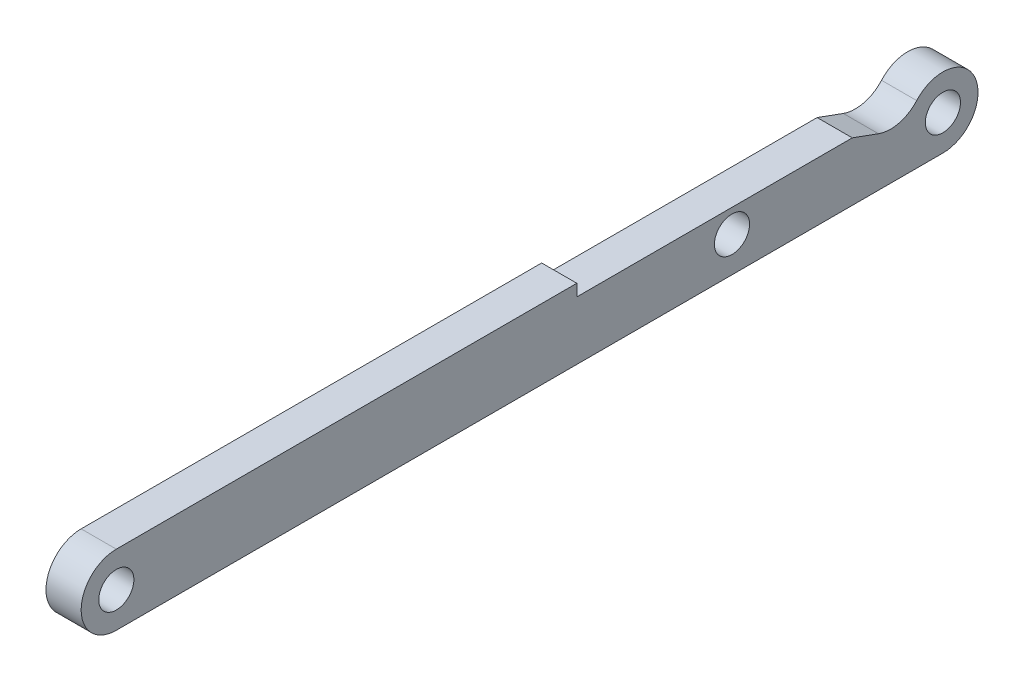
ISO-10303-21;
HEADER;
FILE_DESCRIPTION(('STEP AP214'),'2;1');
FILE_NAME('part.step','',(''),(''),'','','');
FILE_SCHEMA(('AUTOMOTIVE_DESIGN { 1 0 10303 214 1 1 1 1 }'));
ENDSEC;
DATA;
#1=APPLICATION_CONTEXT('core data for automotive mechanical design processes');
#2=APPLICATION_PROTOCOL_DEFINITION('international standard','automotive_design',2000,#1);
#3=PRODUCT_CONTEXT('',#1,'mechanical');
#4=PRODUCT('Part','Part','',(#3));
#5=PRODUCT_RELATED_PRODUCT_CATEGORY('part','',(#4));
#6=PRODUCT_DEFINITION_FORMATION('','',#4);
#7=PRODUCT_DEFINITION_CONTEXT('part definition',#1,'design');
#8=PRODUCT_DEFINITION('design','',#6,#7);
#9=PRODUCT_DEFINITION_SHAPE('','',#8);
#10=(LENGTH_UNIT() NAMED_UNIT(*) SI_UNIT(.MILLI.,.METRE.));
#11=(NAMED_UNIT(*) PLANE_ANGLE_UNIT() SI_UNIT($,.RADIAN.));
#12=(NAMED_UNIT(*) SI_UNIT($,.STERADIAN.) SOLID_ANGLE_UNIT());
#13=UNCERTAINTY_MEASURE_WITH_UNIT(LENGTH_MEASURE(1.E-05),#10,'distance_accuracy_value','');
#14=(GEOMETRIC_REPRESENTATION_CONTEXT(3) GLOBAL_UNCERTAINTY_ASSIGNED_CONTEXT((#13)) GLOBAL_UNIT_ASSIGNED_CONTEXT((#10,
#11,#12)) REPRESENTATION_CONTEXT('',''));
#15=CARTESIAN_POINT('',(0.,0.,0.));
#16=DIRECTION('',(0.,0.,1.));
#17=DIRECTION('',(1.,0.,0.));
#18=AXIS2_PLACEMENT_3D('',#15,#16,#17);
#19=CARTESIAN_POINT('',(-1.,-0.162479586942259,0.153639897585327));
#20=DIRECTION('',(1.,0.,0.));
#21=DIRECTION('',(0.,0.,-1.));
#22=AXIS2_PLACEMENT_3D('',#19,#20,#21);
#23=CYLINDRICAL_SURFACE('',#22,2.);
#24=DIRECTION('',(1.,0.,0.));
#25=VECTOR('',#24,1.);
#26=CARTESIAN_POINT('',(-1.,-2.04186482851408,0.837680184236665));
#27=LINE('',#26,#25);
#28=CARTESIAN_POINT('',(-1.,-2.04186482851408,0.837680184236665));
#29=VERTEX_POINT('',#28);
#30=CARTESIAN_POINT('',(1.,-2.04186482851408,0.837680184236665));
#31=VERTEX_POINT('',#30);
#32=EDGE_CURVE('E123',#29,#31,#27,.T.);
#33=ORIENTED_EDGE('',*,*,#32,.T.);
#34=CARTESIAN_POINT('',(1.,-0.162479586942259,0.153639897585327));
#35=DIRECTION('',(1.,0.,0.));
#36=DIRECTION('',(0.,0.,-1.));
#37=AXIS2_PLACEMENT_3D('',#34,#35,#36);
#38=CIRCLE('',#37,2.);
#39=CARTESIAN_POINT('',(1.,-1.49545335584422,-1.33739361358043));
#40=VERTEX_POINT('',#39);
#41=EDGE_CURVE('E158',#31,#40,#38,.T.);
#42=ORIENTED_EDGE('',*,*,#41,.T.);
#43=DIRECTION('',(1.,0.,0.));
#44=VECTOR('',#43,1.);
#45=CARTESIAN_POINT('',(-1.,-1.49545335584422,-1.33739361358043));
#46=LINE('',#45,#44);
#47=CARTESIAN_POINT('',(-1.,-1.49545335584422,-1.33739361358043));
#48=VERTEX_POINT('',#47);
#49=EDGE_CURVE('E145',#48,#40,#46,.T.);
#50=ORIENTED_EDGE('',*,*,#49,.F.);
#51=CARTESIAN_POINT('',(-1.,-0.162479586942259,0.153639897585327));
#52=DIRECTION('',(1.,0.,0.));
#53=DIRECTION('',(0.,0.,-1.));
#54=AXIS2_PLACEMENT_3D('',#51,#52,#53);
#55=CIRCLE('',#54,2.);
#56=EDGE_CURVE('E62',#29,#48,#55,.T.);
#57=ORIENTED_EDGE('',*,*,#56,.F.);
#58=EDGE_LOOP('',(#33,#42,#50,#57));
#59=FACE_BOUND('',#58,.T.);
#60=ADVANCED_FACE('F40',(#59),#23,.F.);
#61=CARTESIAN_POINT('',(-1.,-2.82842712474618,-2.8284271247462));
#62=DIRECTION('',(1.,0.,0.));
#63=DIRECTION('',(0.,0.,-1.));
#64=AXIS2_PLACEMENT_3D('',#61,#62,#63);
#65=CYLINDRICAL_SURFACE('',#64,2.);
#66=ORIENTED_EDGE('',*,*,#49,.T.);
#67=CARTESIAN_POINT('',(1.,-2.82842712474618,-2.8284271247462));
#68=DIRECTION('',(1.,0.,0.));
#69=DIRECTION('',(0.,0.,-1.));
#70=AXIS2_PLACEMENT_3D('',#67,#68,#69);
#71=CIRCLE('',#70,2.);
#72=CARTESIAN_POINT('',(1.,-4.82842712474618,-2.8284271247462));
#73=VERTEX_POINT('',#72);
#74=EDGE_CURVE('E169',#73,#40,#71,.T.);
#75=ORIENTED_EDGE('',*,*,#74,.F.);
#76=DIRECTION('',(1.,0.,0.));
#77=VECTOR('',#76,1.);
#78=CARTESIAN_POINT('',(-1.,-4.82842712474618,-2.8284271247462));
#79=LINE('',#78,#77);
#80=CARTESIAN_POINT('',(-1.,-4.82842712474618,-2.8284271247462));
#81=VERTEX_POINT('',#80);
#82=EDGE_CURVE('E147',#81,#73,#79,.T.);
#83=ORIENTED_EDGE('',*,*,#82,.F.);
#84=CARTESIAN_POINT('',(-1.,-2.82842712474618,-2.8284271247462));
#85=DIRECTION('',(1.,0.,0.));
#86=DIRECTION('',(0.,0.,-1.));
#87=AXIS2_PLACEMENT_3D('',#84,#85,#86);
#88=CIRCLE('',#87,2.);
#89=EDGE_CURVE('E136',#81,#48,#88,.T.);
#90=ORIENTED_EDGE('',*,*,#89,.T.);
#91=EDGE_LOOP('',(#66,#75,#83,#90));
#92=FACE_BOUND('',#91,.T.);
#93=ADVANCED_FACE('F203',(#92),#65,.T.);
#94=CARTESIAN_POINT('',(-1.,-4.82842712474619,0.));
#95=DIRECTION('',(0.,1.,0.));
#96=DIRECTION('',(0.,0.,1.));
#97=AXIS2_PLACEMENT_3D('',#94,#95,#96);
#98=PLANE('',#97);
#99=ORIENTED_EDGE('',*,*,#82,.T.);
#100=DIRECTION('',(0.,0.,1.));
#101=VECTOR('',#100,1.);
#102=CARTESIAN_POINT('',(1.,-4.82842712474619,0.));
#103=LINE('',#102,#101);
#104=CARTESIAN_POINT('',(1.,-4.8284271247462,44.2031609568309));
#105=VERTEX_POINT('',#104);
#106=EDGE_CURVE('E178',#73,#105,#103,.T.);
#107=ORIENTED_EDGE('',*,*,#106,.T.);
#108=DIRECTION('',(1.,0.,0.));
#109=VECTOR('',#108,1.);
#110=CARTESIAN_POINT('',(-1.,-4.8284271247462,44.2031609568309));
#111=LINE('',#110,#109);
#112=CARTESIAN_POINT('',(-1.,-4.8284271247462,44.2031609568309));
#113=VERTEX_POINT('',#112);
#114=EDGE_CURVE('E149',#113,#105,#111,.T.);
#115=ORIENTED_EDGE('',*,*,#114,.F.);
#116=DIRECTION('',(0.,0.,1.));
#117=VECTOR('',#116,1.);
#118=CARTESIAN_POINT('',(-1.,-4.82842712474619,0.));
#119=LINE('',#118,#117);
#120=EDGE_CURVE('E134',#81,#113,#119,.T.);
#121=ORIENTED_EDGE('',*,*,#120,.F.);
#122=EDGE_LOOP('',(#99,#107,#115,#121));
#123=FACE_BOUND('',#122,.T.);
#124=ADVANCED_FACE('F207',(#123),#98,.F.);
#125=CARTESIAN_POINT('',(-1.,-2.8284271247462,44.2031609568309));
#126=DIRECTION('',(1.,0.,0.));
#127=DIRECTION('',(0.,0.,-1.));
#128=AXIS2_PLACEMENT_3D('',#125,#126,#127);
#129=CYLINDRICAL_SURFACE('',#128,2.);
#130=ORIENTED_EDGE('',*,*,#114,.T.);
#131=CARTESIAN_POINT('',(1.,-2.8284271247462,44.2031609568309));
#132=DIRECTION('',(1.,0.,0.));
#133=DIRECTION('',(0.,0.,-1.));
#134=AXIS2_PLACEMENT_3D('',#131,#132,#133);
#135=CIRCLE('',#134,2.);
#136=CARTESIAN_POINT('',(1.,-0.828427124746204,44.2031609568309));
#137=VERTEX_POINT('',#136);
#138=EDGE_CURVE('E175',#137,#105,#135,.T.);
#139=ORIENTED_EDGE('',*,*,#138,.F.);
#140=DIRECTION('',(1.,0.,0.));
#141=VECTOR('',#140,1.);
#142=CARTESIAN_POINT('',(-1.,-0.828427124746204,44.2031609568309));
#143=LINE('',#142,#141);
#144=CARTESIAN_POINT('',(-1.,-0.828427124746204,44.2031609568309));
#145=VERTEX_POINT('',#144);
#146=EDGE_CURVE('E151',#145,#137,#143,.T.);
#147=ORIENTED_EDGE('',*,*,#146,.F.);
#148=CARTESIAN_POINT('',(-1.,-2.8284271247462,44.2031609568309));
#149=DIRECTION('',(1.,0.,0.));
#150=DIRECTION('',(0.,0.,-1.));
#151=AXIS2_PLACEMENT_3D('',#148,#149,#150);
#152=CIRCLE('',#151,2.);
#153=EDGE_CURVE('E126',#145,#113,#152,.T.);
#154=ORIENTED_EDGE('',*,*,#153,.T.);
#155=EDGE_LOOP('',(#130,#139,#147,#154));
#156=FACE_BOUND('',#155,.T.);
#157=ADVANCED_FACE('F213',(#156),#129,.T.);
#158=CARTESIAN_POINT('',(-1.,-0.828427124746184,0.));
#159=DIRECTION('',(0.,1.,0.));
#160=DIRECTION('',(0.,0.,1.));
#161=AXIS2_PLACEMENT_3D('',#158,#159,#160);
#162=PLANE('',#161);
#163=DIRECTION('',(1.,0.,0.));
#164=VECTOR('',#163,1.);
#165=CARTESIAN_POINT('',(-1.,-0.828427124746191,18.));
#166=LINE('',#165,#164);
#167=CARTESIAN_POINT('',(-1.,-0.828427124746191,18.));
#168=VERTEX_POINT('',#167);
#169=CARTESIAN_POINT('',(1.,-0.828427124746184,18.));
#170=VERTEX_POINT('',#169);
#171=EDGE_CURVE('E120',#168,#170,#166,.T.);
#172=ORIENTED_EDGE('',*,*,#171,.F.);
#173=DIRECTION('',(0.,0.,1.));
#174=VECTOR('',#173,1.);
#175=CARTESIAN_POINT('',(-1.,-0.828427124746184,0.));
#176=LINE('',#175,#174);
#177=EDGE_CURVE('E124',#168,#145,#176,.T.);
#178=ORIENTED_EDGE('',*,*,#177,.T.);
#179=ORIENTED_EDGE('',*,*,#146,.T.);
#180=DIRECTION('',(0.,0.,1.));
#181=VECTOR('',#180,1.);
#182=CARTESIAN_POINT('',(1.,-0.828427124746184,0.));
#183=LINE('',#182,#181);
#184=EDGE_CURVE('E161',#170,#137,#183,.T.);
#185=ORIENTED_EDGE('',*,*,#184,.F.);
#186=EDGE_LOOP('',(#172,#178,#179,#185));
#187=FACE_BOUND('',#186,.T.);
#188=ADVANCED_FACE('F222',(#187),#162,.T.);
#189=CARTESIAN_POINT('',(-1.,-2.82842712474618,-2.8284271247462));
#190=DIRECTION('',(1.,0.,0.));
#191=DIRECTION('',(0.,0.,-1.));
#192=AXIS2_PLACEMENT_3D('',#189,#190,#191);
#193=CYLINDRICAL_SURFACE('',#192,1.);
#194=CARTESIAN_POINT('',(-1.,-2.82842712474618,-2.8284271247462));
#195=DIRECTION('',(1.,0.,0.));
#196=DIRECTION('',(0.,0.,-1.));
#197=AXIS2_PLACEMENT_3D('',#194,#195,#196);
#198=CIRCLE('',#197,1.);
#199=CARTESIAN_POINT('',(-1.,-2.82842712474618,-3.8284271247462));
#200=VERTEX_POINT('',#199);
#201=EDGE_CURVE('E139',#200,#200,#198,.T.);
#202=ORIENTED_EDGE('',*,*,#201,.F.);
#203=EDGE_LOOP('',(#202));
#204=FACE_BOUND('',#203,.T.);
#205=CARTESIAN_POINT('',(1.,-2.82842712474618,-2.8284271247462));
#206=DIRECTION('',(1.,0.,0.));
#207=DIRECTION('',(0.,0.,-1.));
#208=AXIS2_PLACEMENT_3D('',#205,#206,#207);
#209=CIRCLE('',#208,1.);
#210=CARTESIAN_POINT('',(1.,-2.82842712474618,-3.8284271247462));
#211=VERTEX_POINT('',#210);
#212=EDGE_CURVE('E182',#211,#211,#209,.T.);
#213=ORIENTED_EDGE('',*,*,#212,.T.);
#214=EDGE_LOOP('',(#213));
#215=FACE_BOUND('',#214,.T.);
#216=ADVANCED_FACE('F217',(#204,#215),#193,.F.);
#217=CARTESIAN_POINT('',(-1.,-2.07223723865232,0.754232673207433));
#218=DIRECTION('',(0.,0.939692620785908,-0.342020143325669));
#219=DIRECTION('',(0.,0.342020143325669,0.939692620785908));
#220=AXIS2_PLACEMENT_3D('',#217,#218,#219);
#221=PLANE('',#220);
#222=DIRECTION('',(1.,0.,0.));
#223=VECTOR('',#222,1.);
#224=CARTESIAN_POINT('',(-82.1732035595984,-1.5,2.32644156497574));
#225=LINE('',#224,#223);
#226=CARTESIAN_POINT('',(-1.,-1.5,2.32644156497574));
#227=VERTEX_POINT('',#226);
#228=CARTESIAN_POINT('',(1.,-1.5,2.32644156497574));
#229=VERTEX_POINT('',#228);
#230=EDGE_CURVE('E104',#227,#229,#225,.T.);
#231=ORIENTED_EDGE('',*,*,#230,.T.);
#232=DIRECTION('',(0.,0.342020143325669,0.939692620785908));
#233=VECTOR('',#232,1.);
#234=CARTESIAN_POINT('',(1.,-2.07223723865232,0.754232673207433));
#235=LINE('',#234,#233);
#236=EDGE_CURVE('E159',#31,#229,#235,.T.);
#237=ORIENTED_EDGE('',*,*,#236,.F.);
#238=ORIENTED_EDGE('',*,*,#32,.F.);
#239=DIRECTION('',(0.,0.342020143325669,0.939692620785908));
#240=VECTOR('',#239,1.);
#241=CARTESIAN_POINT('',(-1.,-2.07223723865232,0.754232673207433));
#242=LINE('',#241,#240);
#243=EDGE_CURVE('E118',#29,#227,#242,.T.);
#244=ORIENTED_EDGE('',*,*,#243,.T.);
#245=EDGE_LOOP('',(#231,#237,#238,#244));
#246=FACE_BOUND('',#245,.T.);
#247=ADVANCED_FACE('F122',(#246),#221,.T.);
#248=CARTESIAN_POINT('',(-1.,-2.8284271247462,44.2031609568309));
#249=DIRECTION('',(1.,0.,0.));
#250=DIRECTION('',(0.,0.,-1.));
#251=AXIS2_PLACEMENT_3D('',#248,#249,#250);
#252=CYLINDRICAL_SURFACE('',#251,0.999999999999983);
#253=CARTESIAN_POINT('',(-1.,-2.8284271247462,44.2031609568309));
#254=DIRECTION('',(1.,0.,0.));
#255=DIRECTION('',(0.,0.,-1.));
#256=AXIS2_PLACEMENT_3D('',#253,#254,#255);
#257=CIRCLE('',#256,0.999999999999983);
#258=CARTESIAN_POINT('',(-1.,-2.8284271247462,43.2031609568309));
#259=VERTEX_POINT('',#258);
#260=EDGE_CURVE('E142',#259,#259,#257,.T.);
#261=ORIENTED_EDGE('',*,*,#260,.F.);
#262=EDGE_LOOP('',(#261));
#263=FACE_BOUND('',#262,.T.);
#264=CARTESIAN_POINT('',(1.,-2.8284271247462,44.2031609568309));
#265=DIRECTION('',(1.,0.,0.));
#266=DIRECTION('',(0.,0.,-1.));
#267=AXIS2_PLACEMENT_3D('',#264,#265,#266);
#268=CIRCLE('',#267,0.999999999999983);
#269=CARTESIAN_POINT('',(1.,-2.8284271247462,43.2031609568309));
#270=VERTEX_POINT('',#269);
#271=EDGE_CURVE('E128',#270,#270,#268,.T.);
#272=ORIENTED_EDGE('',*,*,#271,.T.);
#273=EDGE_LOOP('',(#272));
#274=FACE_BOUND('',#273,.T.);
#275=ADVANCED_FACE('F187',(#263,#274),#252,.F.);
#276=CARTESIAN_POINT('',(-1.,0.,0.));
#277=DIRECTION('',(1.,0.,0.));
#278=DIRECTION('',(0.,0.,-1.));
#279=AXIS2_PLACEMENT_3D('',#276,#277,#278);
#280=PLANE('',#279);
#281=CARTESIAN_POINT('',(-1.,-2.82842712474617,9.17157287525379));
#282=DIRECTION('',(1.,0.,0.));
#283=DIRECTION('',(0.,0.,-1.));
#284=AXIS2_PLACEMENT_3D('',#281,#282,#283);
#285=CIRCLE('',#284,0.999999999999998);
#286=CARTESIAN_POINT('',(-1.,-2.82842712474617,8.1715728752538));
#287=VERTEX_POINT('',#286);
#288=EDGE_CURVE('E354',#287,#287,#285,.T.);
#289=ORIENTED_EDGE('',*,*,#288,.T.);
#290=EDGE_LOOP('',(#289));
#291=FACE_BOUND('',#290,.T.);
#292=ORIENTED_EDGE('',*,*,#177,.F.);
#293=DIRECTION('',(0.,-1.,0.));
#294=VECTOR('',#293,1.);
#295=CARTESIAN_POINT('',(-1.,0.,18.));
#296=LINE('',#295,#294);
#297=CARTESIAN_POINT('',(-1.,-1.5,18.));
#298=VERTEX_POINT('',#297);
#299=EDGE_CURVE('E119',#168,#298,#296,.T.);
#300=ORIENTED_EDGE('',*,*,#299,.T.);
#301=DIRECTION('',(0.,0.,-1.));
#302=VECTOR('',#301,1.);
#303=CARTESIAN_POINT('',(-1.,-1.5,0.));
#304=LINE('',#303,#302);
#305=EDGE_CURVE('E107',#298,#227,#304,.T.);
#306=ORIENTED_EDGE('',*,*,#305,.T.);
#307=ORIENTED_EDGE('',*,*,#243,.F.);
#308=ORIENTED_EDGE('',*,*,#56,.T.);
#309=ORIENTED_EDGE('',*,*,#89,.F.);
#310=ORIENTED_EDGE('',*,*,#120,.T.);
#311=ORIENTED_EDGE('',*,*,#153,.F.);
#312=EDGE_LOOP('',(#292,#300,#306,#307,#308,#309,#310,#311));
#313=FACE_BOUND('',#312,.T.);
#314=ORIENTED_EDGE('',*,*,#201,.T.);
#315=EDGE_LOOP('',(#314));
#316=FACE_BOUND('',#315,.T.);
#317=ORIENTED_EDGE('',*,*,#260,.T.);
#318=EDGE_LOOP('',(#317));
#319=FACE_BOUND('',#318,.T.);
#320=ADVANCED_FACE('F116',(#291,#313,#316,#319),#280,.F.);
#321=CARTESIAN_POINT('',(1.,0.,0.));
#322=DIRECTION('',(1.,0.,0.));
#323=DIRECTION('',(0.,0.,-1.));
#324=AXIS2_PLACEMENT_3D('',#321,#322,#323);
#325=PLANE('',#324);
#326=CARTESIAN_POINT('',(1.,-2.82842712474617,9.17157287525379));
#327=DIRECTION('',(1.,0.,0.));
#328=DIRECTION('',(0.,0.,-1.));
#329=AXIS2_PLACEMENT_3D('',#326,#327,#328);
#330=CIRCLE('',#329,0.999999999999998);
#331=CARTESIAN_POINT('',(1.,-2.82842712474617,8.1715728752538));
#332=VERTEX_POINT('',#331);
#333=EDGE_CURVE('E43',#332,#332,#330,.T.);
#334=ORIENTED_EDGE('',*,*,#333,.F.);
#335=EDGE_LOOP('',(#334));
#336=FACE_BOUND('',#335,.T.);
#337=DIRECTION('',(0.,-1.,0.));
#338=VECTOR('',#337,1.);
#339=CARTESIAN_POINT('',(1.,0.,18.));
#340=LINE('',#339,#338);
#341=CARTESIAN_POINT('',(1.,-1.5,18.));
#342=VERTEX_POINT('',#341);
#343=EDGE_CURVE('E11',#170,#342,#340,.T.);
#344=ORIENTED_EDGE('',*,*,#343,.F.);
#345=ORIENTED_EDGE('',*,*,#184,.T.);
#346=ORIENTED_EDGE('',*,*,#138,.T.);
#347=ORIENTED_EDGE('',*,*,#106,.F.);
#348=ORIENTED_EDGE('',*,*,#74,.T.);
#349=ORIENTED_EDGE('',*,*,#41,.F.);
#350=ORIENTED_EDGE('',*,*,#236,.T.);
#351=DIRECTION('',(0.,0.,-1.));
#352=VECTOR('',#351,1.);
#353=CARTESIAN_POINT('',(1.,-1.5,0.));
#354=LINE('',#353,#352);
#355=EDGE_CURVE('E48',#342,#229,#354,.T.);
#356=ORIENTED_EDGE('',*,*,#355,.F.);
#357=EDGE_LOOP('',(#344,#345,#346,#347,#348,#349,#350,#356));
#358=FACE_BOUND('',#357,.T.);
#359=ORIENTED_EDGE('',*,*,#212,.F.);
#360=EDGE_LOOP('',(#359));
#361=FACE_BOUND('',#360,.T.);
#362=ORIENTED_EDGE('',*,*,#271,.F.);
#363=EDGE_LOOP('',(#362));
#364=FACE_BOUND('',#363,.T.);
#365=ADVANCED_FACE('F165',(#336,#358,#361,#364),#325,.T.);
#366=CARTESIAN_POINT('',(-82.1732035595984,0.,18.));
#367=DIRECTION('',(0.,0.,1.));
#368=DIRECTION('',(1.,0.,0.));
#369=AXIS2_PLACEMENT_3D('',#366,#367,#368);
#370=PLANE('',#369);
#371=ORIENTED_EDGE('',*,*,#171,.T.);
#372=ORIENTED_EDGE('',*,*,#343,.T.);
#373=DIRECTION('',(1.,0.,0.));
#374=VECTOR('',#373,1.);
#375=CARTESIAN_POINT('',(-82.1732035595984,-1.5,18.));
#376=LINE('',#375,#374);
#377=EDGE_CURVE('E55',#298,#342,#376,.T.);
#378=ORIENTED_EDGE('',*,*,#377,.F.);
#379=ORIENTED_EDGE('',*,*,#299,.F.);
#380=EDGE_LOOP('',(#371,#372,#378,#379));
#381=FACE_BOUND('',#380,.T.);
#382=ADVANCED_FACE('F190',(#381),#370,.F.);
#383=CARTESIAN_POINT('',(-82.1732035595984,-1.5,18.));
#384=DIRECTION('',(0.,-1.,0.));
#385=DIRECTION('',(0.,0.,-1.));
#386=AXIS2_PLACEMENT_3D('',#383,#384,#385);
#387=PLANE('',#386);
#388=ORIENTED_EDGE('',*,*,#377,.T.);
#389=ORIENTED_EDGE('',*,*,#355,.T.);
#390=ORIENTED_EDGE('',*,*,#230,.F.);
#391=ORIENTED_EDGE('',*,*,#305,.F.);
#392=EDGE_LOOP('',(#388,#389,#390,#391));
#393=FACE_BOUND('',#392,.T.);
#394=ADVANCED_FACE('F106',(#393),#387,.F.);
#395=CARTESIAN_POINT('',(-82.1732035595984,-2.82842712474617,9.17157287525379));
#396=DIRECTION('',(1.,0.,0.));
#397=DIRECTION('',(0.,0.,-1.));
#398=AXIS2_PLACEMENT_3D('',#395,#396,#397);
#399=CYLINDRICAL_SURFACE('',#398,0.999999999999998);
#400=ORIENTED_EDGE('',*,*,#333,.T.);
#401=EDGE_LOOP('',(#400));
#402=FACE_BOUND('',#401,.T.);
#403=ORIENTED_EDGE('',*,*,#288,.F.);
#404=EDGE_LOOP('',(#403));
#405=FACE_BOUND('',#404,.T.);
#406=ADVANCED_FACE('F333',(#402,#405),#399,.F.);
#407=CLOSED_SHELL('',(#60,#93,#124,#157,#188,#216,#247,#275,#320,#365,#382,#394,#406));
#408=MANIFOLD_SOLID_BREP('B2',#407);
#409=ADVANCED_BREP_SHAPE_REPRESENTATION('',(#18,#408),#14);
#410=SHAPE_DEFINITION_REPRESENTATION(#9,#409);
ENDSEC;
END-ISO-10303-21;
